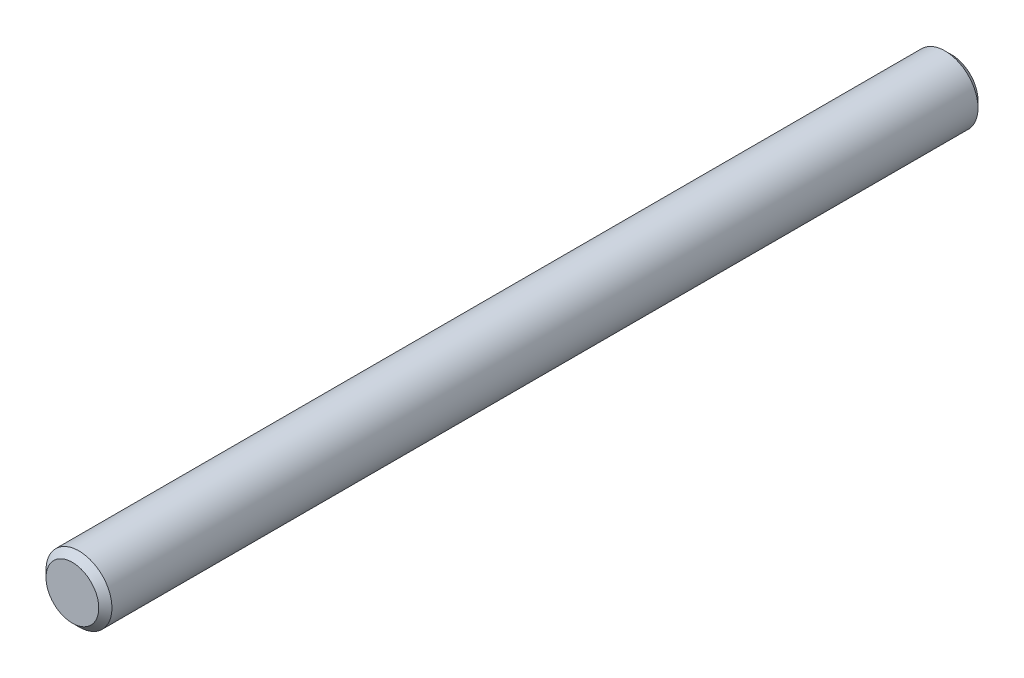
ISO-10303-21;
HEADER;
FILE_DESCRIPTION(('STEP AP214'),'2;1');
FILE_NAME('part.step','',(''),(''),'','','');
FILE_SCHEMA(('AUTOMOTIVE_DESIGN { 1 0 10303 214 1 1 1 1 }'));
ENDSEC;
DATA;
#1=APPLICATION_CONTEXT('core data for automotive mechanical design processes');
#2=APPLICATION_PROTOCOL_DEFINITION('international standard','automotive_design',2000,#1);
#3=PRODUCT_CONTEXT('',#1,'mechanical');
#4=PRODUCT('Part','Part','',(#3));
#5=PRODUCT_RELATED_PRODUCT_CATEGORY('part','',(#4));
#6=PRODUCT_DEFINITION_FORMATION('','',#4);
#7=PRODUCT_DEFINITION_CONTEXT('part definition',#1,'design');
#8=PRODUCT_DEFINITION('design','',#6,#7);
#9=PRODUCT_DEFINITION_SHAPE('','',#8);
#10=(LENGTH_UNIT() NAMED_UNIT(*) SI_UNIT(.MILLI.,.METRE.));
#11=(NAMED_UNIT(*) PLANE_ANGLE_UNIT() SI_UNIT($,.RADIAN.));
#12=(NAMED_UNIT(*) SI_UNIT($,.STERADIAN.) SOLID_ANGLE_UNIT());
#13=UNCERTAINTY_MEASURE_WITH_UNIT(LENGTH_MEASURE(1.E-05),#10,'distance_accuracy_value','');
#14=(GEOMETRIC_REPRESENTATION_CONTEXT(3) GLOBAL_UNCERTAINTY_ASSIGNED_CONTEXT((#13)) GLOBAL_UNIT_ASSIGNED_CONTEXT((#10,
#11,#12)) REPRESENTATION_CONTEXT('',''));
#15=CARTESIAN_POINT('',(0.,0.,0.));
#16=DIRECTION('',(0.,0.,1.));
#17=DIRECTION('',(1.,0.,0.));
#18=AXIS2_PLACEMENT_3D('',#15,#16,#17);
#19=CARTESIAN_POINT('',(0.,0.,20.));
#20=DIRECTION('',(0.,0.,-1.));
#21=DIRECTION('',(-1.,0.,0.));
#22=AXIS2_PLACEMENT_3D('',#19,#20,#21);
#23=CYLINDRICAL_SURFACE('',#22,1.5);
#24=CARTESIAN_POINT('',(0.,0.,-19.7));
#25=DIRECTION('',(0.,0.,1.));
#26=DIRECTION('',(1.,0.,0.));
#27=AXIS2_PLACEMENT_3D('',#24,#25,#26);
#28=CIRCLE('',#27,1.5);
#29=CARTESIAN_POINT('',(1.5,0.,-19.7));
#30=VERTEX_POINT('',#29);
#31=EDGE_CURVE('E44',#30,#30,#28,.T.);
#32=ORIENTED_EDGE('',*,*,#31,.T.);
#33=EDGE_LOOP('',(#32));
#34=FACE_BOUND('',#33,.T.);
#35=CARTESIAN_POINT('',(0.,0.,19.7));
#36=DIRECTION('',(0.,0.,1.));
#37=DIRECTION('',(1.,0.,0.));
#38=AXIS2_PLACEMENT_3D('',#35,#36,#37);
#39=CIRCLE('',#38,1.5);
#40=CARTESIAN_POINT('',(1.5,0.,19.7));
#41=VERTEX_POINT('',#40);
#42=EDGE_CURVE('E48',#41,#41,#39,.F.);
#43=ORIENTED_EDGE('',*,*,#42,.T.);
#44=EDGE_LOOP('',(#43));
#45=FACE_BOUND('',#44,.T.);
#46=ADVANCED_FACE('F33',(#34,#45),#23,.T.);
#47=CARTESIAN_POINT('',(0.,0.,20.));
#48=DIRECTION('',(0.,0.,1.));
#49=DIRECTION('',(1.,0.,0.));
#50=AXIS2_PLACEMENT_3D('',#47,#48,#49);
#51=PLANE('',#50);
#52=CARTESIAN_POINT('',(0.,0.,20.));
#53=DIRECTION('',(0.,0.,1.));
#54=DIRECTION('',(1.,0.,0.));
#55=AXIS2_PLACEMENT_3D('',#52,#53,#54);
#56=CIRCLE('',#55,1.20000000000001);
#57=CARTESIAN_POINT('',(1.20000000000001,0.,20.));
#58=VERTEX_POINT('',#57);
#59=EDGE_CURVE('E10',#58,#58,#56,.T.);
#60=ORIENTED_EDGE('',*,*,#59,.T.);
#61=EDGE_LOOP('',(#60));
#62=FACE_BOUND('',#61,.T.);
#63=ADVANCED_FACE('F64',(#62),#51,.T.);
#64=CARTESIAN_POINT('',(0.,0.,-20.));
#65=DIRECTION('',(0.,0.,1.));
#66=DIRECTION('',(1.,0.,0.));
#67=AXIS2_PLACEMENT_3D('',#64,#65,#66);
#68=PLANE('',#67);
#69=CARTESIAN_POINT('',(0.,0.,-20.));
#70=DIRECTION('',(0.,0.,1.));
#71=DIRECTION('',(1.,0.,0.));
#72=AXIS2_PLACEMENT_3D('',#69,#70,#71);
#73=CIRCLE('',#72,1.2);
#74=CARTESIAN_POINT('',(1.2,0.,-20.));
#75=VERTEX_POINT('',#74);
#76=EDGE_CURVE('E40',#75,#75,#73,.F.);
#77=ORIENTED_EDGE('',*,*,#76,.T.);
#78=EDGE_LOOP('',(#77));
#79=FACE_BOUND('',#78,.T.);
#80=ADVANCED_FACE('F61',(#79),#68,.F.);
#81=CARTESIAN_POINT('',(0.,0.,-19.7));
#82=DIRECTION('',(0.,0.,1.));
#83=DIRECTION('',(1.,0.,0.));
#84=AXIS2_PLACEMENT_3D('',#81,#82,#83);
#85=CONICAL_SURFACE('',#84,1.5,0.785398163397451);
#86=ORIENTED_EDGE('',*,*,#76,.F.);
#87=EDGE_LOOP('',(#86));
#88=FACE_BOUND('',#87,.T.);
#89=ORIENTED_EDGE('',*,*,#31,.F.);
#90=EDGE_LOOP('',(#89));
#91=FACE_BOUND('',#90,.T.);
#92=ADVANCED_FACE('F57',(#88,#91),#85,.T.);
#93=CARTESIAN_POINT('',(0.,0.,20.));
#94=DIRECTION('',(0.,0.,-1.));
#95=DIRECTION('',(-1.,0.,0.));
#96=AXIS2_PLACEMENT_3D('',#93,#94,#95);
#97=CONICAL_SURFACE('',#96,1.20000000000001,0.785398163397446);
#98=ORIENTED_EDGE('',*,*,#42,.F.);
#99=EDGE_LOOP('',(#98));
#100=FACE_BOUND('',#99,.T.);
#101=ORIENTED_EDGE('',*,*,#59,.F.);
#102=EDGE_LOOP('',(#101));
#103=FACE_BOUND('',#102,.T.);
#104=ADVANCED_FACE('F35',(#100,#103),#97,.T.);
#105=CLOSED_SHELL('',(#46,#63,#80,#92,#104));
#106=MANIFOLD_SOLID_BREP('B2',#105);
#107=ADVANCED_BREP_SHAPE_REPRESENTATION('',(#18,#106),#14);
#108=SHAPE_DEFINITION_REPRESENTATION(#9,#107);
ENDSEC;
END-ISO-10303-21;
